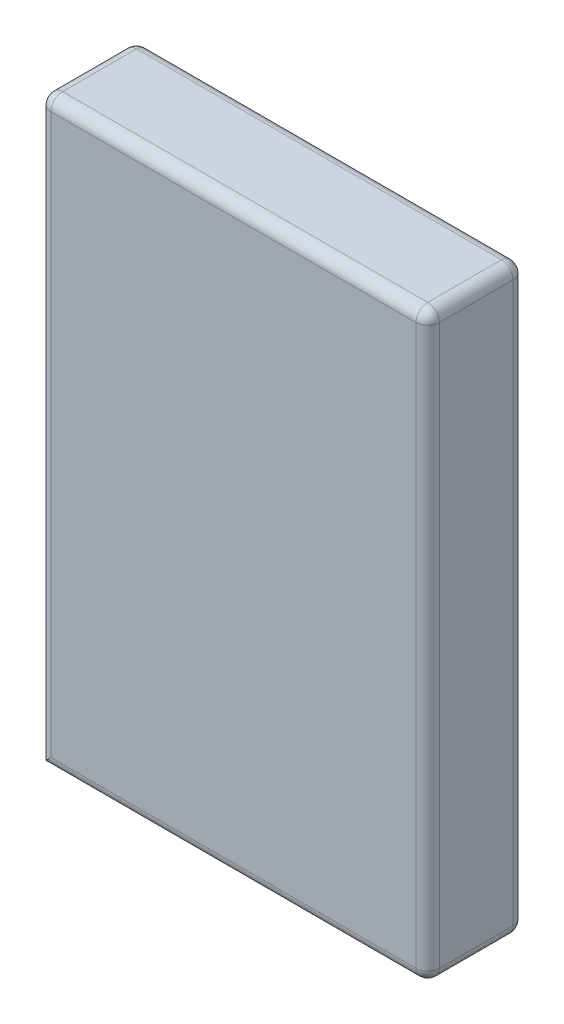
ISO-10303-21;
HEADER;
FILE_DESCRIPTION(('STEP AP214'),'2;1');
FILE_NAME('part.step','',(''),(''),'','','');
FILE_SCHEMA(('AUTOMOTIVE_DESIGN { 1 0 10303 214 1 1 1 1 }'));
ENDSEC;
DATA;
#1=APPLICATION_CONTEXT('core data for automotive mechanical design processes');
#2=APPLICATION_PROTOCOL_DEFINITION('international standard','automotive_design',2000,#1);
#3=PRODUCT_CONTEXT('',#1,'mechanical');
#4=PRODUCT('Part','Part','',(#3));
#5=PRODUCT_RELATED_PRODUCT_CATEGORY('part','',(#4));
#6=PRODUCT_DEFINITION_FORMATION('','',#4);
#7=PRODUCT_DEFINITION_CONTEXT('part definition',#1,'design');
#8=PRODUCT_DEFINITION('design','',#6,#7);
#9=PRODUCT_DEFINITION_SHAPE('','',#8);
#10=(LENGTH_UNIT() NAMED_UNIT(*) SI_UNIT(.MILLI.,.METRE.));
#11=(NAMED_UNIT(*) PLANE_ANGLE_UNIT() SI_UNIT($,.RADIAN.));
#12=(NAMED_UNIT(*) SI_UNIT($,.STERADIAN.) SOLID_ANGLE_UNIT());
#13=UNCERTAINTY_MEASURE_WITH_UNIT(LENGTH_MEASURE(1.E-05),#10,'distance_accuracy_value','');
#14=(GEOMETRIC_REPRESENTATION_CONTEXT(3) GLOBAL_UNCERTAINTY_ASSIGNED_CONTEXT((#13)) GLOBAL_UNIT_ASSIGNED_CONTEXT((#10,
#11,#12)) REPRESENTATION_CONTEXT('',''));
#15=CARTESIAN_POINT('',(0.,0.,0.));
#16=DIRECTION('',(0.,0.,1.));
#17=DIRECTION('',(1.,0.,0.));
#18=AXIS2_PLACEMENT_3D('',#15,#16,#17);
#19=CARTESIAN_POINT('',(-12.7,-19.05,6.35));
#20=DIRECTION('',(1.,0.,0.));
#21=DIRECTION('',(0.,0.,-1.));
#22=AXIS2_PLACEMENT_3D('',#19,#20,#21);
#23=PLANE('',#22);
#24=DIRECTION('',(0.,0.,-1.));
#25=VECTOR('',#24,1.);
#26=CARTESIAN_POINT('',(-12.7,-19.05,6.35));
#27=LINE('',#26,#25);
#28=CARTESIAN_POINT('',(-12.7,-19.05,5.588));
#29=VERTEX_POINT('',#28);
#30=CARTESIAN_POINT('',(-12.7,-19.05,0.762));
#31=VERTEX_POINT('',#30);
#32=EDGE_CURVE('E151',#29,#31,#27,.T.);
#33=ORIENTED_EDGE('',*,*,#32,.F.);
#34=DIRECTION('',(0.,-1.,0.));
#35=VECTOR('',#34,1.);
#36=CARTESIAN_POINT('',(-12.7,19.05,5.588));
#37=LINE('',#36,#35);
#38=CARTESIAN_POINT('',(-12.7,18.288,5.588));
#39=VERTEX_POINT('',#38);
#40=EDGE_CURVE('E170',#29,#39,#37,.F.);
#41=ORIENTED_EDGE('',*,*,#40,.T.);
#42=DIRECTION('',(0.,0.,-1.));
#43=VECTOR('',#42,1.);
#44=CARTESIAN_POINT('',(-12.7,18.288,6.35));
#45=LINE('',#44,#43);
#46=CARTESIAN_POINT('',(-12.7,18.288,0.762));
#47=VERTEX_POINT('',#46);
#48=EDGE_CURVE('E168',#39,#47,#45,.T.);
#49=ORIENTED_EDGE('',*,*,#48,.T.);
#50=DIRECTION('',(0.,-1.,0.));
#51=VECTOR('',#50,1.);
#52=CARTESIAN_POINT('',(-12.7,-19.05,0.762));
#53=LINE('',#52,#51);
#54=EDGE_CURVE('E166',#47,#31,#53,.T.);
#55=ORIENTED_EDGE('',*,*,#54,.T.);
#56=EDGE_LOOP('',(#33,#41,#49,#55));
#57=FACE_BOUND('',#56,.T.);
#58=ADVANCED_FACE('F39',(#57),#23,.F.);
#59=CARTESIAN_POINT('',(12.7,-19.05,6.35));
#60=DIRECTION('',(0.,1.,0.));
#61=DIRECTION('',(-1.,0.,0.));
#62=AXIS2_PLACEMENT_3D('',#59,#60,#61);
#63=PLANE('',#62);
#64=DIRECTION('',(0.,0.,-1.));
#65=VECTOR('',#64,1.);
#66=CARTESIAN_POINT('',(11.938,-19.05,6.35));
#67=LINE('',#66,#65);
#68=CARTESIAN_POINT('',(11.938,-19.05,0.762));
#69=VERTEX_POINT('',#68);
#70=CARTESIAN_POINT('',(11.938,-19.05,5.588));
#71=VERTEX_POINT('',#70);
#72=EDGE_CURVE('E157',#69,#71,#67,.F.);
#73=ORIENTED_EDGE('',*,*,#72,.T.);
#74=DIRECTION('',(1.,0.,0.));
#75=VECTOR('',#74,1.);
#76=CARTESIAN_POINT('',(-12.7,-19.05,5.588));
#77=LINE('',#76,#75);
#78=EDGE_CURVE('E129',#71,#29,#77,.F.);
#79=ORIENTED_EDGE('',*,*,#78,.T.);
#80=ORIENTED_EDGE('',*,*,#32,.T.);
#81=DIRECTION('',(1.,0.,0.));
#82=VECTOR('',#81,1.);
#83=CARTESIAN_POINT('',(12.7,-19.05,0.762));
#84=LINE('',#83,#82);
#85=EDGE_CURVE('E159',#31,#69,#84,.T.);
#86=ORIENTED_EDGE('',*,*,#85,.T.);
#87=EDGE_LOOP('',(#73,#79,#80,#86));
#88=FACE_BOUND('',#87,.T.);
#89=ADVANCED_FACE('F260',(#88),#63,.F.);
#90=CARTESIAN_POINT('',(12.7,-19.05,6.35));
#91=DIRECTION('',(-1.,0.,0.));
#92=DIRECTION('',(0.,0.,1.));
#93=AXIS2_PLACEMENT_3D('',#90,#91,#92);
#94=PLANE('',#93);
#95=DIRECTION('',(0.,1.,0.));
#96=VECTOR('',#95,1.);
#97=CARTESIAN_POINT('',(12.7,-19.05,5.588));
#98=LINE('',#97,#96);
#99=CARTESIAN_POINT('',(12.7,18.288,5.588));
#100=VERTEX_POINT('',#99);
#101=CARTESIAN_POINT('',(12.7,-18.288,5.588));
#102=VERTEX_POINT('',#101);
#103=EDGE_CURVE('E48',#100,#102,#98,.F.);
#104=ORIENTED_EDGE('',*,*,#103,.T.);
#105=DIRECTION('',(0.,0.,-1.));
#106=VECTOR('',#105,1.);
#107=CARTESIAN_POINT('',(12.7,-18.288,6.35));
#108=LINE('',#107,#106);
#109=CARTESIAN_POINT('',(12.7,-18.288,0.762));
#110=VERTEX_POINT('',#109);
#111=EDGE_CURVE('E11',#102,#110,#108,.T.);
#112=ORIENTED_EDGE('',*,*,#111,.T.);
#113=DIRECTION('',(0.,1.,0.));
#114=VECTOR('',#113,1.);
#115=CARTESIAN_POINT('',(12.7,-19.05,0.762));
#116=LINE('',#115,#114);
#117=CARTESIAN_POINT('',(12.7,18.288,0.762));
#118=VERTEX_POINT('',#117);
#119=EDGE_CURVE('E190',#110,#118,#116,.T.);
#120=ORIENTED_EDGE('',*,*,#119,.T.);
#121=DIRECTION('',(0.,0.,-1.));
#122=VECTOR('',#121,1.);
#123=CARTESIAN_POINT('',(12.7,18.288,6.35));
#124=LINE('',#123,#122);
#125=EDGE_CURVE('E59',#118,#100,#124,.F.);
#126=ORIENTED_EDGE('',*,*,#125,.T.);
#127=EDGE_LOOP('',(#104,#112,#120,#126));
#128=FACE_BOUND('',#127,.T.);
#129=ADVANCED_FACE('F278',(#128),#94,.F.);
#130=CARTESIAN_POINT('',(12.7,19.05,6.35));
#131=DIRECTION('',(0.,-1.,0.));
#132=DIRECTION('',(0.,0.,-1.));
#133=AXIS2_PLACEMENT_3D('',#130,#131,#132);
#134=PLANE('',#133);
#135=DIRECTION('',(0.,0.,-1.));
#136=VECTOR('',#135,1.);
#137=CARTESIAN_POINT('',(-11.938,19.05,6.35));
#138=LINE('',#137,#136);
#139=CARTESIAN_POINT('',(-11.938,19.05,0.762));
#140=VERTEX_POINT('',#139);
#141=CARTESIAN_POINT('',(-11.938,19.05,5.588));
#142=VERTEX_POINT('',#141);
#143=EDGE_CURVE('E176',#140,#142,#138,.F.);
#144=ORIENTED_EDGE('',*,*,#143,.T.);
#145=DIRECTION('',(-1.,0.,0.));
#146=VECTOR('',#145,1.);
#147=CARTESIAN_POINT('',(12.7,19.05,5.588));
#148=LINE('',#147,#146);
#149=CARTESIAN_POINT('',(11.938,19.05,5.588));
#150=VERTEX_POINT('',#149);
#151=EDGE_CURVE('E178',#142,#150,#148,.F.);
#152=ORIENTED_EDGE('',*,*,#151,.T.);
#153=DIRECTION('',(0.,0.,-1.));
#154=VECTOR('',#153,1.);
#155=CARTESIAN_POINT('',(11.938,19.05,6.35));
#156=LINE('',#155,#154);
#157=CARTESIAN_POINT('',(11.938,19.05,0.762));
#158=VERTEX_POINT('',#157);
#159=EDGE_CURVE('E172',#150,#158,#156,.T.);
#160=ORIENTED_EDGE('',*,*,#159,.T.);
#161=DIRECTION('',(-1.,0.,0.));
#162=VECTOR('',#161,1.);
#163=CARTESIAN_POINT('',(12.7,19.05,0.762));
#164=LINE('',#163,#162);
#165=EDGE_CURVE('E174',#158,#140,#164,.T.);
#166=ORIENTED_EDGE('',*,*,#165,.T.);
#167=EDGE_LOOP('',(#144,#152,#160,#166));
#168=FACE_BOUND('',#167,.T.);
#169=ADVANCED_FACE('F440',(#168),#134,.F.);
#170=CARTESIAN_POINT('',(0.,0.,6.35));
#171=DIRECTION('',(0.,0.,1.));
#172=DIRECTION('',(1.,0.,0.));
#173=AXIS2_PLACEMENT_3D('',#170,#171,#172);
#174=PLANE('',#173);
#175=DIRECTION('',(0.,-1.,0.));
#176=VECTOR('',#175,1.);
#177=CARTESIAN_POINT('',(-11.938,-19.05,6.35));
#178=LINE('',#177,#176);
#179=CARTESIAN_POINT('',(-11.938,18.288,6.35));
#180=VERTEX_POINT('',#179);
#181=CARTESIAN_POINT('',(-11.938,-18.288,6.35));
#182=VERTEX_POINT('',#181);
#183=EDGE_CURVE('E155',#180,#182,#178,.T.);
#184=ORIENTED_EDGE('',*,*,#183,.T.);
#185=DIRECTION('',(1.,0.,0.));
#186=VECTOR('',#185,1.);
#187=CARTESIAN_POINT('',(12.7,-18.288,6.35));
#188=LINE('',#187,#186);
#189=CARTESIAN_POINT('',(11.938,-18.288,6.35));
#190=VERTEX_POINT('',#189);
#191=EDGE_CURVE('E127',#182,#190,#188,.T.);
#192=ORIENTED_EDGE('',*,*,#191,.T.);
#193=DIRECTION('',(0.,1.,0.));
#194=VECTOR('',#193,1.);
#195=CARTESIAN_POINT('',(11.938,19.05,6.35));
#196=LINE('',#195,#194);
#197=CARTESIAN_POINT('',(11.938,18.288,6.35));
#198=VERTEX_POINT('',#197);
#199=EDGE_CURVE('E144',#190,#198,#196,.T.);
#200=ORIENTED_EDGE('',*,*,#199,.T.);
#201=DIRECTION('',(-1.,0.,0.));
#202=VECTOR('',#201,1.);
#203=CARTESIAN_POINT('',(-12.7,18.288,6.35));
#204=LINE('',#203,#202);
#205=EDGE_CURVE('E150',#198,#180,#204,.T.);
#206=ORIENTED_EDGE('',*,*,#205,.T.);
#207=EDGE_LOOP('',(#184,#192,#200,#206));
#208=FACE_BOUND('',#207,.T.);
#209=ADVANCED_FACE('F153',(#208),#174,.T.);
#210=CARTESIAN_POINT('',(0.,0.,0.));
#211=DIRECTION('',(0.,0.,1.));
#212=DIRECTION('',(1.,0.,0.));
#213=AXIS2_PLACEMENT_3D('',#210,#211,#212);
#214=PLANE('',#213);
#215=DIRECTION('',(1.,0.,0.));
#216=VECTOR('',#215,1.);
#217=CARTESIAN_POINT('',(0.,-18.288,0.));
#218=LINE('',#217,#216);
#219=CARTESIAN_POINT('',(11.938,-18.288,0.));
#220=VERTEX_POINT('',#219);
#221=CARTESIAN_POINT('',(-11.938,-18.288,0.));
#222=VERTEX_POINT('',#221);
#223=EDGE_CURVE('E185',#220,#222,#218,.F.);
#224=ORIENTED_EDGE('',*,*,#223,.T.);
#225=DIRECTION('',(0.,-1.,0.));
#226=VECTOR('',#225,1.);
#227=CARTESIAN_POINT('',(-11.938,0.,0.));
#228=LINE('',#227,#226);
#229=CARTESIAN_POINT('',(-11.938,18.288,0.));
#230=VERTEX_POINT('',#229);
#231=EDGE_CURVE('E188',#222,#230,#228,.F.);
#232=ORIENTED_EDGE('',*,*,#231,.T.);
#233=DIRECTION('',(-1.,0.,0.));
#234=VECTOR('',#233,1.);
#235=CARTESIAN_POINT('',(0.,18.288,0.));
#236=LINE('',#235,#234);
#237=CARTESIAN_POINT('',(11.938,18.288,0.));
#238=VERTEX_POINT('',#237);
#239=EDGE_CURVE('E183',#230,#238,#236,.F.);
#240=ORIENTED_EDGE('',*,*,#239,.T.);
#241=DIRECTION('',(0.,1.,0.));
#242=VECTOR('',#241,1.);
#243=CARTESIAN_POINT('',(11.938,0.,0.));
#244=LINE('',#243,#242);
#245=EDGE_CURVE('E181',#238,#220,#244,.F.);
#246=ORIENTED_EDGE('',*,*,#245,.T.);
#247=EDGE_LOOP('',(#224,#232,#240,#246));
#248=FACE_BOUND('',#247,.T.);
#249=ADVANCED_FACE('F423',(#248),#214,.F.);
#250=CARTESIAN_POINT('',(12.7,18.288,0.762));
#251=DIRECTION('',(-1.,0.,0.));
#252=DIRECTION('',(0.,0.,1.));
#253=AXIS2_PLACEMENT_3D('',#250,#251,#252);
#254=CYLINDRICAL_SURFACE('',#253,0.762);
#255=CARTESIAN_POINT('',(11.938,18.288,0.762));
#256=DIRECTION('',(1.,0.,0.));
#257=DIRECTION('',(0.,0.,-1.));
#258=AXIS2_PLACEMENT_3D('',#255,#256,#257);
#259=CIRCLE('',#258,0.762);
#260=EDGE_CURVE('E43',#238,#158,#259,.T.);
#261=ORIENTED_EDGE('',*,*,#260,.F.);
#262=ORIENTED_EDGE('',*,*,#239,.F.);
#263=CARTESIAN_POINT('',(-11.938,18.288,0.762));
#264=DIRECTION('',(-1.,0.,0.));
#265=DIRECTION('',(0.,0.,1.));
#266=AXIS2_PLACEMENT_3D('',#263,#264,#265);
#267=CIRCLE('',#266,0.762);
#268=EDGE_CURVE('E229',#140,#230,#267,.T.);
#269=ORIENTED_EDGE('',*,*,#268,.F.);
#270=ORIENTED_EDGE('',*,*,#165,.F.);
#271=EDGE_LOOP('',(#261,#262,#269,#270));
#272=FACE_BOUND('',#271,.T.);
#273=ADVANCED_FACE('F41',(#272),#254,.T.);
#274=CARTESIAN_POINT('',(11.938,18.288,0.762));
#275=DIRECTION('',(0.,0.,1.));
#276=DIRECTION('',(1.,0.,0.));
#277=AXIS2_PLACEMENT_3D('',#274,#275,#276);
#278=SPHERICAL_SURFACE('',#277,0.762);
#279=CARTESIAN_POINT('',(11.938,18.288,0.762));
#280=DIRECTION('',(0.,1.,0.));
#281=DIRECTION('',(0.,0.,1.));
#282=AXIS2_PLACEMENT_3D('',#279,#280,#281);
#283=CIRCLE('',#282,0.762);
#284=EDGE_CURVE('E223',#238,#118,#283,.F.);
#285=ORIENTED_EDGE('',*,*,#284,.F.);
#286=ORIENTED_EDGE('',*,*,#260,.T.);
#287=CARTESIAN_POINT('',(11.938,18.288,0.762));
#288=DIRECTION('',(0.,0.,-1.));
#289=DIRECTION('',(-1.,0.,0.));
#290=AXIS2_PLACEMENT_3D('',#287,#288,#289);
#291=CIRCLE('',#290,0.762);
#292=EDGE_CURVE('E226',#118,#158,#291,.F.);
#293=ORIENTED_EDGE('',*,*,#292,.F.);
#294=EDGE_LOOP('',(#285,#286,#293));
#295=FACE_BOUND('',#294,.T.);
#296=ADVANCED_FACE('F282',(#295),#278,.T.);
#297=CARTESIAN_POINT('',(-11.938,-19.05,0.762));
#298=DIRECTION('',(0.,-1.,0.));
#299=DIRECTION('',(0.,0.,-1.));
#300=AXIS2_PLACEMENT_3D('',#297,#298,#299);
#301=CYLINDRICAL_SURFACE('',#300,0.762);
#302=CARTESIAN_POINT('',(-11.938,18.288,0.762));
#303=DIRECTION('',(0.,1.,0.));
#304=DIRECTION('',(0.,0.,1.));
#305=AXIS2_PLACEMENT_3D('',#302,#303,#304);
#306=CIRCLE('',#305,0.762);
#307=EDGE_CURVE('E231',#230,#47,#306,.T.);
#308=ORIENTED_EDGE('',*,*,#307,.F.);
#309=ORIENTED_EDGE('',*,*,#231,.F.);
#310=CARTESIAN_POINT('',(-11.938,-18.288,0.762));
#311=DIRECTION('',(0.707106781186548,-0.707106781186547,0.));
#312=DIRECTION('',(-0.707106781186547,-0.707106781186548,0.));
#313=AXIS2_PLACEMENT_3D('',#310,#311,#312);
#314=ELLIPSE('',#313,1.0776307345283,0.762);
#315=EDGE_CURVE('E221',#31,#222,#314,.T.);
#316=ORIENTED_EDGE('',*,*,#315,.F.);
#317=ORIENTED_EDGE('',*,*,#54,.F.);
#318=EDGE_LOOP('',(#308,#309,#316,#317));
#319=FACE_BOUND('',#318,.T.);
#320=ADVANCED_FACE('F264',(#319),#301,.T.);
#321=CARTESIAN_POINT('',(-11.938,18.288,0.762));
#322=DIRECTION('',(0.,0.,1.));
#323=DIRECTION('',(1.,0.,0.));
#324=AXIS2_PLACEMENT_3D('',#321,#322,#323);
#325=SPHERICAL_SURFACE('',#324,0.762);
#326=ORIENTED_EDGE('',*,*,#268,.T.);
#327=ORIENTED_EDGE('',*,*,#307,.T.);
#328=CARTESIAN_POINT('',(-11.938,18.288,0.762));
#329=DIRECTION('',(0.,0.,-1.));
#330=DIRECTION('',(-1.,0.,0.));
#331=AXIS2_PLACEMENT_3D('',#328,#329,#330);
#332=CIRCLE('',#331,0.762);
#333=EDGE_CURVE('E218',#140,#47,#332,.F.);
#334=ORIENTED_EDGE('',*,*,#333,.F.);
#335=EDGE_LOOP('',(#326,#327,#334));
#336=FACE_BOUND('',#335,.T.);
#337=ADVANCED_FACE('F395',(#336),#325,.T.);
#338=CARTESIAN_POINT('',(11.938,18.288,6.35));
#339=DIRECTION('',(0.,0.,-1.));
#340=DIRECTION('',(-1.,0.,0.));
#341=AXIS2_PLACEMENT_3D('',#338,#339,#340);
#342=CYLINDRICAL_SURFACE('',#341,0.762);
#343=ORIENTED_EDGE('',*,*,#292,.T.);
#344=ORIENTED_EDGE('',*,*,#159,.F.);
#345=CARTESIAN_POINT('',(11.938,18.288,5.588));
#346=DIRECTION('',(0.,0.,1.));
#347=DIRECTION('',(1.,0.,0.));
#348=AXIS2_PLACEMENT_3D('',#345,#346,#347);
#349=CIRCLE('',#348,0.762);
#350=EDGE_CURVE('E213',#100,#150,#349,.T.);
#351=ORIENTED_EDGE('',*,*,#350,.F.);
#352=ORIENTED_EDGE('',*,*,#125,.F.);
#353=EDGE_LOOP('',(#343,#344,#351,#352));
#354=FACE_BOUND('',#353,.T.);
#355=ADVANCED_FACE('F285',(#354),#342,.T.);
#356=CARTESIAN_POINT('',(11.938,-19.05,0.762));
#357=DIRECTION('',(0.,1.,0.));
#358=DIRECTION('',(0.,0.,1.));
#359=AXIS2_PLACEMENT_3D('',#356,#357,#358);
#360=CYLINDRICAL_SURFACE('',#359,0.762);
#361=ORIENTED_EDGE('',*,*,#284,.T.);
#362=ORIENTED_EDGE('',*,*,#119,.F.);
#363=CARTESIAN_POINT('',(11.938,-18.288,0.762));
#364=DIRECTION('',(0.,-1.,0.));
#365=DIRECTION('',(0.,0.,-1.));
#366=AXIS2_PLACEMENT_3D('',#363,#364,#365);
#367=CIRCLE('',#366,0.762);
#368=EDGE_CURVE('E210',#220,#110,#367,.T.);
#369=ORIENTED_EDGE('',*,*,#368,.F.);
#370=ORIENTED_EDGE('',*,*,#245,.F.);
#371=EDGE_LOOP('',(#361,#362,#369,#370));
#372=FACE_BOUND('',#371,.T.);
#373=ADVANCED_FACE('F281',(#372),#360,.T.);
#374=CARTESIAN_POINT('',(12.7,-18.288,0.762));
#375=DIRECTION('',(1.,0.,0.));
#376=DIRECTION('',(0.,1.,0.));
#377=AXIS2_PLACEMENT_3D('',#374,#375,#376);
#378=CYLINDRICAL_SURFACE('',#377,0.762);
#379=ORIENTED_EDGE('',*,*,#315,.T.);
#380=ORIENTED_EDGE('',*,*,#223,.F.);
#381=CARTESIAN_POINT('',(11.938,-18.288,0.762));
#382=DIRECTION('',(1.,0.,0.));
#383=DIRECTION('',(0.,0.,-1.));
#384=AXIS2_PLACEMENT_3D('',#381,#382,#383);
#385=CIRCLE('',#384,0.762);
#386=EDGE_CURVE('E207',#69,#220,#385,.T.);
#387=ORIENTED_EDGE('',*,*,#386,.F.);
#388=ORIENTED_EDGE('',*,*,#85,.F.);
#389=EDGE_LOOP('',(#379,#380,#387,#388));
#390=FACE_BOUND('',#389,.T.);
#391=ADVANCED_FACE('F270',(#390),#378,.T.);
#392=CARTESIAN_POINT('',(-11.938,18.288,6.35));
#393=DIRECTION('',(0.,0.,-1.));
#394=DIRECTION('',(-1.,0.,0.));
#395=AXIS2_PLACEMENT_3D('',#392,#393,#394);
#396=CYLINDRICAL_SURFACE('',#395,0.762);
#397=ORIENTED_EDGE('',*,*,#333,.T.);
#398=ORIENTED_EDGE('',*,*,#48,.F.);
#399=CARTESIAN_POINT('',(-11.938,18.288,5.588));
#400=DIRECTION('',(0.,0.,1.));
#401=DIRECTION('',(1.,0.,0.));
#402=AXIS2_PLACEMENT_3D('',#399,#400,#401);
#403=CIRCLE('',#402,0.762);
#404=EDGE_CURVE('E204',#142,#39,#403,.T.);
#405=ORIENTED_EDGE('',*,*,#404,.F.);
#406=ORIENTED_EDGE('',*,*,#143,.F.);
#407=EDGE_LOOP('',(#397,#398,#405,#406));
#408=FACE_BOUND('',#407,.T.);
#409=ADVANCED_FACE('F295',(#408),#396,.T.);
#410=CARTESIAN_POINT('',(0.,18.288,5.588));
#411=DIRECTION('',(1.,0.,0.));
#412=DIRECTION('',(0.,0.,-1.));
#413=AXIS2_PLACEMENT_3D('',#410,#411,#412);
#414=CYLINDRICAL_SURFACE('',#413,0.762);
#415=CARTESIAN_POINT('',(11.938,18.288,5.588));
#416=DIRECTION('',(1.,0.,0.));
#417=DIRECTION('',(0.,0.,-1.));
#418=AXIS2_PLACEMENT_3D('',#415,#416,#417);
#419=CIRCLE('',#418,0.762);
#420=EDGE_CURVE('E215',#150,#198,#419,.T.);
#421=ORIENTED_EDGE('',*,*,#420,.F.);
#422=ORIENTED_EDGE('',*,*,#151,.F.);
#423=CARTESIAN_POINT('',(-11.938,18.288,5.588));
#424=DIRECTION('',(-1.,0.,0.));
#425=DIRECTION('',(0.,0.,1.));
#426=AXIS2_PLACEMENT_3D('',#423,#424,#425);
#427=CIRCLE('',#426,0.762);
#428=EDGE_CURVE('E201',#180,#142,#427,.T.);
#429=ORIENTED_EDGE('',*,*,#428,.F.);
#430=ORIENTED_EDGE('',*,*,#205,.F.);
#431=EDGE_LOOP('',(#421,#422,#429,#430));
#432=FACE_BOUND('',#431,.T.);
#433=ADVANCED_FACE('F251',(#432),#414,.T.);
#434=CARTESIAN_POINT('',(11.938,18.288,5.588));
#435=DIRECTION('',(0.,0.,1.));
#436=DIRECTION('',(1.,0.,0.));
#437=AXIS2_PLACEMENT_3D('',#434,#435,#436);
#438=SPHERICAL_SURFACE('',#437,0.762);
#439=ORIENTED_EDGE('',*,*,#350,.T.);
#440=ORIENTED_EDGE('',*,*,#420,.T.);
#441=CARTESIAN_POINT('',(11.938,18.288,5.588));
#442=DIRECTION('',(0.,1.,0.));
#443=DIRECTION('',(0.,0.,1.));
#444=AXIS2_PLACEMENT_3D('',#441,#442,#443);
#445=CIRCLE('',#444,0.762);
#446=EDGE_CURVE('E147',#100,#198,#445,.F.);
#447=ORIENTED_EDGE('',*,*,#446,.F.);
#448=EDGE_LOOP('',(#439,#440,#447));
#449=FACE_BOUND('',#448,.T.);
#450=ADVANCED_FACE('F287',(#449),#438,.T.);
#451=CARTESIAN_POINT('',(11.938,-18.288,0.762));
#452=DIRECTION('',(0.,0.,1.));
#453=DIRECTION('',(1.,0.,0.));
#454=AXIS2_PLACEMENT_3D('',#451,#452,#453);
#455=SPHERICAL_SURFACE('',#454,0.762);
#456=ORIENTED_EDGE('',*,*,#386,.T.);
#457=ORIENTED_EDGE('',*,*,#368,.T.);
#458=CARTESIAN_POINT('',(11.938,-18.288,0.762));
#459=DIRECTION('',(0.,0.,-1.));
#460=DIRECTION('',(-1.,0.,0.));
#461=AXIS2_PLACEMENT_3D('',#458,#459,#460);
#462=CIRCLE('',#461,0.762);
#463=EDGE_CURVE('E198',#69,#110,#462,.F.);
#464=ORIENTED_EDGE('',*,*,#463,.F.);
#465=EDGE_LOOP('',(#456,#457,#464));
#466=FACE_BOUND('',#465,.T.);
#467=ADVANCED_FACE('F274',(#466),#455,.T.);
#468=CARTESIAN_POINT('',(-11.938,18.288,5.588));
#469=DIRECTION('',(0.,0.,1.));
#470=DIRECTION('',(1.,0.,0.));
#471=AXIS2_PLACEMENT_3D('',#468,#469,#470);
#472=SPHERICAL_SURFACE('',#471,0.762);
#473=ORIENTED_EDGE('',*,*,#428,.T.);
#474=ORIENTED_EDGE('',*,*,#404,.T.);
#475=CARTESIAN_POINT('',(-11.938,18.288,5.588));
#476=DIRECTION('',(0.,1.,0.));
#477=DIRECTION('',(0.,0.,1.));
#478=AXIS2_PLACEMENT_3D('',#475,#476,#477);
#479=CIRCLE('',#478,0.762);
#480=EDGE_CURVE('E141',#180,#39,#479,.F.);
#481=ORIENTED_EDGE('',*,*,#480,.F.);
#482=EDGE_LOOP('',(#473,#474,#481));
#483=FACE_BOUND('',#482,.T.);
#484=ADVANCED_FACE('F254',(#483),#472,.T.);
#485=CARTESIAN_POINT('',(11.938,0.,5.588));
#486=DIRECTION('',(0.,-1.,0.));
#487=DIRECTION('',(0.,0.,-1.));
#488=AXIS2_PLACEMENT_3D('',#485,#486,#487);
#489=CYLINDRICAL_SURFACE('',#488,0.762);
#490=ORIENTED_EDGE('',*,*,#446,.T.);
#491=ORIENTED_EDGE('',*,*,#199,.F.);
#492=CARTESIAN_POINT('',(11.938,-18.288,5.588));
#493=DIRECTION('',(0.,-1.,0.));
#494=DIRECTION('',(0.,0.,-1.));
#495=AXIS2_PLACEMENT_3D('',#492,#493,#494);
#496=CIRCLE('',#495,0.762);
#497=EDGE_CURVE('E135',#102,#190,#496,.T.);
#498=ORIENTED_EDGE('',*,*,#497,.F.);
#499=ORIENTED_EDGE('',*,*,#103,.F.);
#500=EDGE_LOOP('',(#490,#491,#498,#499));
#501=FACE_BOUND('',#500,.T.);
#502=ADVANCED_FACE('F145',(#501),#489,.T.);
#503=CARTESIAN_POINT('',(11.938,-18.288,6.35));
#504=DIRECTION('',(0.,0.,-1.));
#505=DIRECTION('',(-1.,0.,0.));
#506=AXIS2_PLACEMENT_3D('',#503,#504,#505);
#507=CYLINDRICAL_SURFACE('',#506,0.762);
#508=ORIENTED_EDGE('',*,*,#463,.T.);
#509=ORIENTED_EDGE('',*,*,#111,.F.);
#510=CARTESIAN_POINT('',(11.938,-18.288,5.588));
#511=DIRECTION('',(0.,0.,1.));
#512=DIRECTION('',(1.,0.,0.));
#513=AXIS2_PLACEMENT_3D('',#510,#511,#512);
#514=CIRCLE('',#513,0.762);
#515=EDGE_CURVE('E139',#71,#102,#514,.T.);
#516=ORIENTED_EDGE('',*,*,#515,.F.);
#517=ORIENTED_EDGE('',*,*,#72,.F.);
#518=EDGE_LOOP('',(#508,#509,#516,#517));
#519=FACE_BOUND('',#518,.T.);
#520=ADVANCED_FACE('F277',(#519),#507,.T.);
#521=CARTESIAN_POINT('',(-11.938,0.,5.588));
#522=DIRECTION('',(0.,1.,0.));
#523=DIRECTION('',(0.,0.,1.));
#524=AXIS2_PLACEMENT_3D('',#521,#522,#523);
#525=CYLINDRICAL_SURFACE('',#524,0.762);
#526=ORIENTED_EDGE('',*,*,#480,.T.);
#527=ORIENTED_EDGE('',*,*,#40,.F.);
#528=CARTESIAN_POINT('',(-11.938,-18.288,5.588));
#529=DIRECTION('',(-0.707106781186548,0.707106781186547,0.));
#530=DIRECTION('',(0.707106781186547,0.707106781186548,0.));
#531=AXIS2_PLACEMENT_3D('',#528,#529,#530);
#532=ELLIPSE('',#531,1.0776307345283,0.762);
#533=EDGE_CURVE('E132',#182,#29,#532,.F.);
#534=ORIENTED_EDGE('',*,*,#533,.F.);
#535=ORIENTED_EDGE('',*,*,#183,.F.);
#536=EDGE_LOOP('',(#526,#527,#534,#535));
#537=FACE_BOUND('',#536,.T.);
#538=ADVANCED_FACE('F257',(#537),#525,.T.);
#539=CARTESIAN_POINT('',(11.938,-18.288,5.588));
#540=DIRECTION('',(0.,0.,1.));
#541=DIRECTION('',(1.,0.,0.));
#542=AXIS2_PLACEMENT_3D('',#539,#540,#541);
#543=SPHERICAL_SURFACE('',#542,0.762);
#544=ORIENTED_EDGE('',*,*,#515,.T.);
#545=ORIENTED_EDGE('',*,*,#497,.T.);
#546=CARTESIAN_POINT('',(11.938,-18.288,5.588));
#547=DIRECTION('',(1.,0.,0.));
#548=DIRECTION('',(0.,0.,-1.));
#549=AXIS2_PLACEMENT_3D('',#546,#547,#548);
#550=CIRCLE('',#549,0.762);
#551=EDGE_CURVE('E123',#71,#190,#550,.F.);
#552=ORIENTED_EDGE('',*,*,#551,.F.);
#553=EDGE_LOOP('',(#544,#545,#552));
#554=FACE_BOUND('',#553,.T.);
#555=ADVANCED_FACE('F137',(#554),#543,.T.);
#556=CARTESIAN_POINT('',(0.,-18.288,5.588));
#557=DIRECTION('',(-1.,0.,0.));
#558=DIRECTION('',(0.,-1.,0.));
#559=AXIS2_PLACEMENT_3D('',#556,#557,#558);
#560=CYLINDRICAL_SURFACE('',#559,0.762);
#561=ORIENTED_EDGE('',*,*,#533,.T.);
#562=ORIENTED_EDGE('',*,*,#78,.F.);
#563=ORIENTED_EDGE('',*,*,#551,.T.);
#564=ORIENTED_EDGE('',*,*,#191,.F.);
#565=EDGE_LOOP('',(#561,#562,#563,#564));
#566=FACE_BOUND('',#565,.T.);
#567=ADVANCED_FACE('F125',(#566),#560,.T.);
#568=CLOSED_SHELL('',(#58,#89,#129,#169,#209,#249,#273,#296,#320,#337,#355,#373,#391,#409,#433,
#450,#467,#484,#502,#520,#538,#555,#567));
#569=MANIFOLD_SOLID_BREP('B2',#568);
#570=ADVANCED_BREP_SHAPE_REPRESENTATION('',(#18,#569),#14);
#571=SHAPE_DEFINITION_REPRESENTATION(#9,#570);
ENDSEC;
END-ISO-10303-21;
